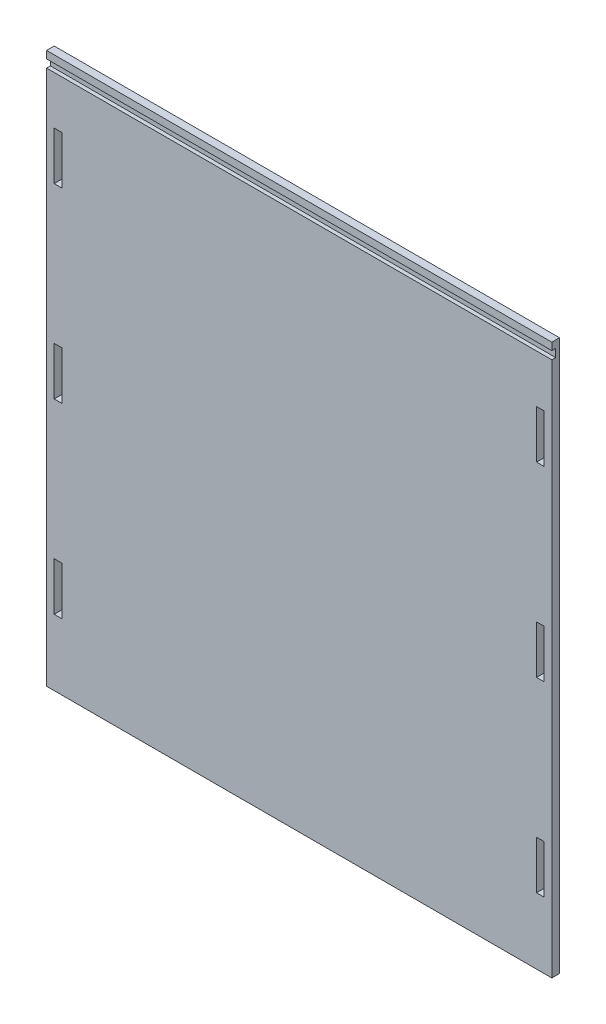
ISO-10303-21;
HEADER;
FILE_DESCRIPTION(('STEP AP214'),'2;1');
FILE_NAME('part.step','',(''),(''),'','','');
FILE_SCHEMA(('AUTOMOTIVE_DESIGN { 1 0 10303 214 1 1 1 1 }'));
ENDSEC;
DATA;
#1=APPLICATION_CONTEXT('core data for automotive mechanical design processes');
#2=APPLICATION_PROTOCOL_DEFINITION('international standard','automotive_design',2000,#1);
#3=PRODUCT_CONTEXT('',#1,'mechanical');
#4=PRODUCT('Part','Part','',(#3));
#5=PRODUCT_RELATED_PRODUCT_CATEGORY('part','',(#4));
#6=PRODUCT_DEFINITION_FORMATION('','',#4);
#7=PRODUCT_DEFINITION_CONTEXT('part definition',#1,'design');
#8=PRODUCT_DEFINITION('design','',#6,#7);
#9=PRODUCT_DEFINITION_SHAPE('','',#8);
#10=(LENGTH_UNIT() NAMED_UNIT(*) SI_UNIT(.MILLI.,.METRE.));
#11=(NAMED_UNIT(*) PLANE_ANGLE_UNIT() SI_UNIT($,.RADIAN.));
#12=(NAMED_UNIT(*) SI_UNIT($,.STERADIAN.) SOLID_ANGLE_UNIT());
#13=UNCERTAINTY_MEASURE_WITH_UNIT(LENGTH_MEASURE(1.E-05),#10,'distance_accuracy_value','');
#14=(GEOMETRIC_REPRESENTATION_CONTEXT(3) GLOBAL_UNCERTAINTY_ASSIGNED_CONTEXT((#13)) GLOBAL_UNIT_ASSIGNED_CONTEXT((#10,
#11,#12)) REPRESENTATION_CONTEXT('',''));
#15=CARTESIAN_POINT('',(0.,0.,0.));
#16=DIRECTION('',(0.,0.,1.));
#17=DIRECTION('',(1.,0.,0.));
#18=AXIS2_PLACEMENT_3D('',#15,#16,#17);
#19=CARTESIAN_POINT('',(0.,0.,6.35));
#20=DIRECTION('',(0.,0.,-1.));
#21=DIRECTION('',(-1.,0.,0.));
#22=AXIS2_PLACEMENT_3D('',#19,#20,#21);
#23=PLANE('',#22);
#24=DIRECTION('',(0.,-1.,0.));
#25=VECTOR('',#24,1.);
#26=CARTESIAN_POINT('',(0.,0.,6.35));
#27=LINE('',#26,#25);
#28=CARTESIAN_POINT('',(0.,457.7,6.35));
#29=VERTEX_POINT('',#28);
#30=CARTESIAN_POINT('',(0.,451.604,6.35));
#31=VERTEX_POINT('',#30);
#32=EDGE_CURVE('E273',#29,#31,#27,.T.);
#33=ORIENTED_EDGE('',*,*,#32,.T.);
#34=DIRECTION('',(1.,0.,0.));
#35=VECTOR('',#34,1.);
#36=CARTESIAN_POINT('',(0.,451.604,6.35));
#37=LINE('',#36,#35);
#38=CARTESIAN_POINT('',(420.,451.604,6.35));
#39=VERTEX_POINT('',#38);
#40=EDGE_CURVE('E332',#31,#39,#37,.T.);
#41=ORIENTED_EDGE('',*,*,#40,.T.);
#42=DIRECTION('',(0.,1.,0.));
#43=VECTOR('',#42,1.);
#44=CARTESIAN_POINT('',(420.,0.,6.35));
#45=LINE('',#44,#43);
#46=CARTESIAN_POINT('',(420.,457.7,6.35));
#47=VERTEX_POINT('',#46);
#48=EDGE_CURVE('E288',#39,#47,#45,.T.);
#49=ORIENTED_EDGE('',*,*,#48,.T.);
#50=DIRECTION('',(-1.,0.,0.));
#51=VECTOR('',#50,1.);
#52=CARTESIAN_POINT('',(413.65,457.7,6.35));
#53=LINE('',#52,#51);
#54=EDGE_CURVE('E291',#47,#29,#53,.T.);
#55=ORIENTED_EDGE('',*,*,#54,.T.);
#56=EDGE_LOOP('',(#33,#41,#49,#55));
#57=FACE_BOUND('',#56,.T.);
#58=ADVANCED_FACE('F39',(#57),#23,.F.);
#59=DIRECTION('',(-1.,0.,0.));
#60=VECTOR('',#59,1.);
#61=CARTESIAN_POINT('',(407.3,95.,6.35));
#62=LINE('',#61,#60);
#63=CARTESIAN_POINT('',(413.65,95.,6.35));
#64=VERTEX_POINT('',#63);
#65=CARTESIAN_POINT('',(407.3,95.,6.35));
#66=VERTEX_POINT('',#65);
#67=EDGE_CURVE('E395',#64,#66,#62,.T.);
#68=ORIENTED_EDGE('',*,*,#67,.F.);
#69=DIRECTION('',(0.,1.,0.));
#70=VECTOR('',#69,1.);
#71=CARTESIAN_POINT('',(413.65,95.,6.35));
#72=LINE('',#71,#70);
#73=CARTESIAN_POINT('',(413.65,55.,6.35));
#74=VERTEX_POINT('',#73);
#75=EDGE_CURVE('E406',#74,#64,#72,.T.);
#76=ORIENTED_EDGE('',*,*,#75,.F.);
#77=DIRECTION('',(1.,0.,0.));
#78=VECTOR('',#77,1.);
#79=CARTESIAN_POINT('',(413.65,55.,6.35));
#80=LINE('',#79,#78);
#81=CARTESIAN_POINT('',(407.3,55.,6.35));
#82=VERTEX_POINT('',#81);
#83=EDGE_CURVE('E402',#82,#74,#80,.T.);
#84=ORIENTED_EDGE('',*,*,#83,.F.);
#85=DIRECTION('',(0.,-1.,0.));
#86=VECTOR('',#85,1.);
#87=CARTESIAN_POINT('',(407.3,55.,6.35));
#88=LINE('',#87,#86);
#89=EDGE_CURVE('E398',#66,#82,#88,.T.);
#90=ORIENTED_EDGE('',*,*,#89,.F.);
#91=EDGE_LOOP('',(#68,#76,#84,#90));
#92=FACE_BOUND('',#91,.T.);
#93=DIRECTION('',(-1.,0.,0.));
#94=VECTOR('',#93,1.);
#95=CARTESIAN_POINT('',(6.34999999999998,250.,6.35));
#96=LINE('',#95,#94);
#97=CARTESIAN_POINT('',(12.7,250.,6.35));
#98=VERTEX_POINT('',#97);
#99=CARTESIAN_POINT('',(6.34999999999998,250.,6.35));
#100=VERTEX_POINT('',#99);
#101=EDGE_CURVE('E481',#98,#100,#96,.T.);
#102=ORIENTED_EDGE('',*,*,#101,.F.);
#103=DIRECTION('',(0.,1.,0.));
#104=VECTOR('',#103,1.);
#105=CARTESIAN_POINT('',(12.7,250.,6.35));
#106=LINE('',#105,#104);
#107=CARTESIAN_POINT('',(12.7,210.,6.35));
#108=VERTEX_POINT('',#107);
#109=EDGE_CURVE('E492',#108,#98,#106,.T.);
#110=ORIENTED_EDGE('',*,*,#109,.F.);
#111=DIRECTION('',(1.,0.,0.));
#112=VECTOR('',#111,1.);
#113=CARTESIAN_POINT('',(12.7,210.,6.35));
#114=LINE('',#113,#112);
#115=CARTESIAN_POINT('',(6.34999999999998,210.,6.35));
#116=VERTEX_POINT('',#115);
#117=EDGE_CURVE('E488',#116,#108,#114,.T.);
#118=ORIENTED_EDGE('',*,*,#117,.F.);
#119=DIRECTION('',(0.,-1.,0.));
#120=VECTOR('',#119,1.);
#121=CARTESIAN_POINT('',(6.34999999999998,210.,6.35));
#122=LINE('',#121,#120);
#123=EDGE_CURVE('E484',#100,#116,#122,.T.);
#124=ORIENTED_EDGE('',*,*,#123,.F.);
#125=EDGE_LOOP('',(#102,#110,#118,#124));
#126=FACE_BOUND('',#125,.T.);
#127=DIRECTION('',(0.,-1.,0.));
#128=VECTOR('',#127,1.);
#129=CARTESIAN_POINT('',(407.3,365.,6.35));
#130=LINE('',#129,#128);
#131=CARTESIAN_POINT('',(407.3,405.,6.35));
#132=VERTEX_POINT('',#131);
#133=CARTESIAN_POINT('',(407.3,365.,6.35));
#134=VERTEX_POINT('',#133);
#135=EDGE_CURVE('E567',#132,#134,#130,.T.);
#136=ORIENTED_EDGE('',*,*,#135,.F.);
#137=DIRECTION('',(-1.,0.,0.));
#138=VECTOR('',#137,1.);
#139=CARTESIAN_POINT('',(407.3,405.,6.35));
#140=LINE('',#139,#138);
#141=CARTESIAN_POINT('',(413.65,405.,6.35));
#142=VERTEX_POINT('',#141);
#143=EDGE_CURVE('E578',#142,#132,#140,.T.);
#144=ORIENTED_EDGE('',*,*,#143,.F.);
#145=DIRECTION('',(0.,1.,0.));
#146=VECTOR('',#145,1.);
#147=CARTESIAN_POINT('',(413.65,405.,6.35));
#148=LINE('',#147,#146);
#149=CARTESIAN_POINT('',(413.65,365.,6.35));
#150=VERTEX_POINT('',#149);
#151=EDGE_CURVE('E574',#150,#142,#148,.T.);
#152=ORIENTED_EDGE('',*,*,#151,.F.);
#153=DIRECTION('',(1.,0.,0.));
#154=VECTOR('',#153,1.);
#155=CARTESIAN_POINT('',(413.65,365.,6.35));
#156=LINE('',#155,#154);
#157=EDGE_CURVE('E570',#134,#150,#156,.T.);
#158=ORIENTED_EDGE('',*,*,#157,.F.);
#159=EDGE_LOOP('',(#136,#144,#152,#158));
#160=FACE_BOUND('',#159,.T.);
#161=CARTESIAN_POINT('',(420.,0.,6.35));
#162=VERTEX_POINT('',#161);
#163=CARTESIAN_POINT('',(420.,445.,6.35));
#164=VERTEX_POINT('',#163);
#165=EDGE_CURVE('E266',#162,#164,#45,.T.);
#166=ORIENTED_EDGE('',*,*,#165,.T.);
#167=DIRECTION('',(1.,0.,0.));
#168=VECTOR('',#167,1.);
#169=CARTESIAN_POINT('',(0.,445.,6.35));
#170=LINE('',#169,#168);
#171=CARTESIAN_POINT('',(0.,445.,6.35));
#172=VERTEX_POINT('',#171);
#173=EDGE_CURVE('E55',#172,#164,#170,.T.);
#174=ORIENTED_EDGE('',*,*,#173,.F.);
#175=CARTESIAN_POINT('',(0.,0.,6.35));
#176=VERTEX_POINT('',#175);
#177=EDGE_CURVE('E263',#172,#176,#27,.T.);
#178=ORIENTED_EDGE('',*,*,#177,.T.);
#179=DIRECTION('',(1.,0.,0.));
#180=VECTOR('',#179,1.);
#181=CARTESIAN_POINT('',(0.,0.,6.35));
#182=LINE('',#181,#180);
#183=EDGE_CURVE('E279',#176,#162,#182,.T.);
#184=ORIENTED_EDGE('',*,*,#183,.T.);
#185=EDGE_LOOP('',(#166,#174,#178,#184));
#186=FACE_BOUND('',#185,.T.);
#187=DIRECTION('',(-1.,0.,0.));
#188=VECTOR('',#187,1.);
#189=CARTESIAN_POINT('',(6.35,405.,6.35));
#190=LINE('',#189,#188);
#191=CARTESIAN_POINT('',(12.7,405.,6.35));
#192=VERTEX_POINT('',#191);
#193=CARTESIAN_POINT('',(6.35,405.,6.35));
#194=VERTEX_POINT('',#193);
#195=EDGE_CURVE('E524',#192,#194,#190,.T.);
#196=ORIENTED_EDGE('',*,*,#195,.F.);
#197=DIRECTION('',(0.,1.,0.));
#198=VECTOR('',#197,1.);
#199=CARTESIAN_POINT('',(12.7,365.,6.35));
#200=LINE('',#199,#198);
#201=CARTESIAN_POINT('',(12.7,365.,6.35));
#202=VERTEX_POINT('',#201);
#203=EDGE_CURVE('E535',#202,#192,#200,.T.);
#204=ORIENTED_EDGE('',*,*,#203,.F.);
#205=DIRECTION('',(1.,0.,0.));
#206=VECTOR('',#205,1.);
#207=CARTESIAN_POINT('',(6.35,365.,6.35));
#208=LINE('',#207,#206);
#209=CARTESIAN_POINT('',(6.35,365.,6.35));
#210=VERTEX_POINT('',#209);
#211=EDGE_CURVE('E531',#210,#202,#208,.T.);
#212=ORIENTED_EDGE('',*,*,#211,.F.);
#213=DIRECTION('',(0.,-1.,0.));
#214=VECTOR('',#213,1.);
#215=CARTESIAN_POINT('',(6.35,405.,6.35));
#216=LINE('',#215,#214);
#217=EDGE_CURVE('E527',#194,#210,#216,.T.);
#218=ORIENTED_EDGE('',*,*,#217,.F.);
#219=EDGE_LOOP('',(#196,#204,#212,#218));
#220=FACE_BOUND('',#219,.T.);
#221=DIRECTION('',(-1.,0.,0.));
#222=VECTOR('',#221,1.);
#223=CARTESIAN_POINT('',(407.3,250.,6.35));
#224=LINE('',#223,#222);
#225=CARTESIAN_POINT('',(413.65,250.,6.35));
#226=VERTEX_POINT('',#225);
#227=CARTESIAN_POINT('',(407.3,250.,6.35));
#228=VERTEX_POINT('',#227);
#229=EDGE_CURVE('E438',#226,#228,#224,.T.);
#230=ORIENTED_EDGE('',*,*,#229,.F.);
#231=DIRECTION('',(0.,1.,0.));
#232=VECTOR('',#231,1.);
#233=CARTESIAN_POINT('',(413.65,250.,6.35));
#234=LINE('',#233,#232);
#235=CARTESIAN_POINT('',(413.65,210.,6.35));
#236=VERTEX_POINT('',#235);
#237=EDGE_CURVE('E449',#236,#226,#234,.T.);
#238=ORIENTED_EDGE('',*,*,#237,.F.);
#239=DIRECTION('',(1.,0.,0.));
#240=VECTOR('',#239,1.);
#241=CARTESIAN_POINT('',(413.65,210.,6.35));
#242=LINE('',#241,#240);
#243=CARTESIAN_POINT('',(407.3,210.,6.35));
#244=VERTEX_POINT('',#243);
#245=EDGE_CURVE('E445',#244,#236,#242,.T.);
#246=ORIENTED_EDGE('',*,*,#245,.F.);
#247=DIRECTION('',(0.,-1.,0.));
#248=VECTOR('',#247,1.);
#249=CARTESIAN_POINT('',(407.3,210.,6.35));
#250=LINE('',#249,#248);
#251=EDGE_CURVE('E441',#228,#244,#250,.T.);
#252=ORIENTED_EDGE('',*,*,#251,.F.);
#253=EDGE_LOOP('',(#230,#238,#246,#252));
#254=FACE_BOUND('',#253,.T.);
#255=DIRECTION('',(-1.,0.,0.));
#256=VECTOR('',#255,1.);
#257=CARTESIAN_POINT('',(6.35000000000003,95.,6.35));
#258=LINE('',#257,#256);
#259=CARTESIAN_POINT('',(12.7,95.,6.35));
#260=VERTEX_POINT('',#259);
#261=CARTESIAN_POINT('',(6.35000000000003,95.,6.35));
#262=VERTEX_POINT('',#261);
#263=EDGE_CURVE('E354',#260,#262,#258,.T.);
#264=ORIENTED_EDGE('',*,*,#263,.F.);
#265=DIRECTION('',(0.,1.,0.));
#266=VECTOR('',#265,1.);
#267=CARTESIAN_POINT('',(12.7,95.,6.35));
#268=LINE('',#267,#266);
#269=CARTESIAN_POINT('',(12.7,55.,6.35));
#270=VERTEX_POINT('',#269);
#271=EDGE_CURVE('E364',#270,#260,#268,.T.);
#272=ORIENTED_EDGE('',*,*,#271,.F.);
#273=DIRECTION('',(1.,0.,0.));
#274=VECTOR('',#273,1.);
#275=CARTESIAN_POINT('',(12.7,55.,6.35));
#276=LINE('',#275,#274);
#277=CARTESIAN_POINT('',(6.35000000000003,55.,6.35));
#278=VERTEX_POINT('',#277);
#279=EDGE_CURVE('E361',#278,#270,#276,.T.);
#280=ORIENTED_EDGE('',*,*,#279,.F.);
#281=DIRECTION('',(0.,-1.,0.));
#282=VECTOR('',#281,1.);
#283=CARTESIAN_POINT('',(6.35000000000003,55.,6.35));
#284=LINE('',#283,#282);
#285=EDGE_CURVE('E357',#262,#278,#284,.T.);
#286=ORIENTED_EDGE('',*,*,#285,.F.);
#287=EDGE_LOOP('',(#264,#272,#280,#286));
#288=FACE_BOUND('',#287,.T.);
#289=ADVANCED_FACE('F261',(#92,#126,#160,#186,#220,#254,#288),#23,.F.);
#290=CARTESIAN_POINT('',(0.,0.,0.));
#291=DIRECTION('',(0.,0.,-1.));
#292=DIRECTION('',(-1.,0.,0.));
#293=AXIS2_PLACEMENT_3D('',#290,#291,#292);
#294=PLANE('',#293);
#295=DIRECTION('',(0.,-1.,0.));
#296=VECTOR('',#295,1.);
#297=CARTESIAN_POINT('',(0.,0.,0.));
#298=LINE('',#297,#296);
#299=CARTESIAN_POINT('',(0.,457.7,0.));
#300=VERTEX_POINT('',#299);
#301=CARTESIAN_POINT('',(0.,0.,0.));
#302=VERTEX_POINT('',#301);
#303=EDGE_CURVE('E295',#300,#302,#298,.T.);
#304=ORIENTED_EDGE('',*,*,#303,.F.);
#305=DIRECTION('',(-1.,0.,0.));
#306=VECTOR('',#305,1.);
#307=CARTESIAN_POINT('',(0.,457.7,0.));
#308=LINE('',#307,#306);
#309=CARTESIAN_POINT('',(420.,457.7,0.));
#310=VERTEX_POINT('',#309);
#311=EDGE_CURVE('E274',#310,#300,#308,.T.);
#312=ORIENTED_EDGE('',*,*,#311,.F.);
#313=DIRECTION('',(0.,1.,0.));
#314=VECTOR('',#313,1.);
#315=CARTESIAN_POINT('',(420.,0.,0.));
#316=LINE('',#315,#314);
#317=CARTESIAN_POINT('',(420.,0.,0.));
#318=VERTEX_POINT('',#317);
#319=EDGE_CURVE('E280',#318,#310,#316,.T.);
#320=ORIENTED_EDGE('',*,*,#319,.F.);
#321=DIRECTION('',(1.,0.,0.));
#322=VECTOR('',#321,1.);
#323=CARTESIAN_POINT('',(0.,0.,0.));
#324=LINE('',#323,#322);
#325=EDGE_CURVE('E298',#302,#318,#324,.T.);
#326=ORIENTED_EDGE('',*,*,#325,.F.);
#327=EDGE_LOOP('',(#304,#312,#320,#326));
#328=FACE_BOUND('',#327,.T.);
#329=DIRECTION('',(-1.,0.,0.));
#330=VECTOR('',#329,1.);
#331=CARTESIAN_POINT('',(407.3,405.,0.));
#332=LINE('',#331,#330);
#333=CARTESIAN_POINT('',(413.65,405.,0.));
#334=VERTEX_POINT('',#333);
#335=CARTESIAN_POINT('',(407.3,405.,0.));
#336=VERTEX_POINT('',#335);
#337=EDGE_CURVE('E571',#334,#336,#332,.T.);
#338=ORIENTED_EDGE('',*,*,#337,.T.);
#339=DIRECTION('',(0.,-1.,0.));
#340=VECTOR('',#339,1.);
#341=CARTESIAN_POINT('',(407.3,365.,0.));
#342=LINE('',#341,#340);
#343=CARTESIAN_POINT('',(407.3,365.,0.));
#344=VERTEX_POINT('',#343);
#345=EDGE_CURVE('E566',#336,#344,#342,.T.);
#346=ORIENTED_EDGE('',*,*,#345,.T.);
#347=DIRECTION('',(1.,0.,0.));
#348=VECTOR('',#347,1.);
#349=CARTESIAN_POINT('',(413.65,365.,0.));
#350=LINE('',#349,#348);
#351=CARTESIAN_POINT('',(413.65,365.,0.));
#352=VERTEX_POINT('',#351);
#353=EDGE_CURVE('E585',#344,#352,#350,.T.);
#354=ORIENTED_EDGE('',*,*,#353,.T.);
#355=DIRECTION('',(0.,1.,0.));
#356=VECTOR('',#355,1.);
#357=CARTESIAN_POINT('',(413.65,405.,0.));
#358=LINE('',#357,#356);
#359=EDGE_CURVE('E589',#352,#334,#358,.T.);
#360=ORIENTED_EDGE('',*,*,#359,.T.);
#361=EDGE_LOOP('',(#338,#346,#354,#360));
#362=FACE_BOUND('',#361,.T.);
#363=DIRECTION('',(0.,1.,0.));
#364=VECTOR('',#363,1.);
#365=CARTESIAN_POINT('',(12.7,365.,0.));
#366=LINE('',#365,#364);
#367=CARTESIAN_POINT('',(12.7,365.,0.));
#368=VERTEX_POINT('',#367);
#369=CARTESIAN_POINT('',(12.7,405.,0.));
#370=VERTEX_POINT('',#369);
#371=EDGE_CURVE('E528',#368,#370,#366,.T.);
#372=ORIENTED_EDGE('',*,*,#371,.T.);
#373=DIRECTION('',(-1.,0.,0.));
#374=VECTOR('',#373,1.);
#375=CARTESIAN_POINT('',(6.35,405.,0.));
#376=LINE('',#375,#374);
#377=CARTESIAN_POINT('',(6.35,405.,0.));
#378=VERTEX_POINT('',#377);
#379=EDGE_CURVE('E523',#370,#378,#376,.T.);
#380=ORIENTED_EDGE('',*,*,#379,.T.);
#381=DIRECTION('',(0.,-1.,0.));
#382=VECTOR('',#381,1.);
#383=CARTESIAN_POINT('',(6.35,405.,0.));
#384=LINE('',#383,#382);
#385=CARTESIAN_POINT('',(6.35,365.,0.));
#386=VERTEX_POINT('',#385);
#387=EDGE_CURVE('E542',#378,#386,#384,.T.);
#388=ORIENTED_EDGE('',*,*,#387,.T.);
#389=DIRECTION('',(1.,0.,0.));
#390=VECTOR('',#389,1.);
#391=CARTESIAN_POINT('',(6.35,365.,0.));
#392=LINE('',#391,#390);
#393=EDGE_CURVE('E546',#386,#368,#392,.T.);
#394=ORIENTED_EDGE('',*,*,#393,.T.);
#395=EDGE_LOOP('',(#372,#380,#388,#394));
#396=FACE_BOUND('',#395,.T.);
#397=DIRECTION('',(0.,1.,0.));
#398=VECTOR('',#397,1.);
#399=CARTESIAN_POINT('',(12.7,250.,0.));
#400=LINE('',#399,#398);
#401=CARTESIAN_POINT('',(12.7,210.,0.));
#402=VERTEX_POINT('',#401);
#403=CARTESIAN_POINT('',(12.7,250.,0.));
#404=VERTEX_POINT('',#403);
#405=EDGE_CURVE('E485',#402,#404,#400,.T.);
#406=ORIENTED_EDGE('',*,*,#405,.T.);
#407=DIRECTION('',(-1.,0.,0.));
#408=VECTOR('',#407,1.);
#409=CARTESIAN_POINT('',(6.34999999999998,250.,0.));
#410=LINE('',#409,#408);
#411=CARTESIAN_POINT('',(6.34999999999998,250.,0.));
#412=VERTEX_POINT('',#411);
#413=EDGE_CURVE('E480',#404,#412,#410,.T.);
#414=ORIENTED_EDGE('',*,*,#413,.T.);
#415=DIRECTION('',(0.,-1.,0.));
#416=VECTOR('',#415,1.);
#417=CARTESIAN_POINT('',(6.34999999999998,210.,0.));
#418=LINE('',#417,#416);
#419=CARTESIAN_POINT('',(6.34999999999998,210.,0.));
#420=VERTEX_POINT('',#419);
#421=EDGE_CURVE('E499',#412,#420,#418,.T.);
#422=ORIENTED_EDGE('',*,*,#421,.T.);
#423=DIRECTION('',(1.,0.,0.));
#424=VECTOR('',#423,1.);
#425=CARTESIAN_POINT('',(12.7,210.,0.));
#426=LINE('',#425,#424);
#427=EDGE_CURVE('E503',#420,#402,#426,.T.);
#428=ORIENTED_EDGE('',*,*,#427,.T.);
#429=EDGE_LOOP('',(#406,#414,#422,#428));
#430=FACE_BOUND('',#429,.T.);
#431=DIRECTION('',(0.,1.,0.));
#432=VECTOR('',#431,1.);
#433=CARTESIAN_POINT('',(413.65,250.,0.));
#434=LINE('',#433,#432);
#435=CARTESIAN_POINT('',(413.65,210.,0.));
#436=VERTEX_POINT('',#435);
#437=CARTESIAN_POINT('',(413.65,250.,0.));
#438=VERTEX_POINT('',#437);
#439=EDGE_CURVE('E442',#436,#438,#434,.T.);
#440=ORIENTED_EDGE('',*,*,#439,.T.);
#441=DIRECTION('',(-1.,0.,0.));
#442=VECTOR('',#441,1.);
#443=CARTESIAN_POINT('',(407.3,250.,0.));
#444=LINE('',#443,#442);
#445=CARTESIAN_POINT('',(407.3,250.,0.));
#446=VERTEX_POINT('',#445);
#447=EDGE_CURVE('E437',#438,#446,#444,.T.);
#448=ORIENTED_EDGE('',*,*,#447,.T.);
#449=DIRECTION('',(0.,-1.,0.));
#450=VECTOR('',#449,1.);
#451=CARTESIAN_POINT('',(407.3,210.,0.));
#452=LINE('',#451,#450);
#453=CARTESIAN_POINT('',(407.3,210.,0.));
#454=VERTEX_POINT('',#453);
#455=EDGE_CURVE('E456',#446,#454,#452,.T.);
#456=ORIENTED_EDGE('',*,*,#455,.T.);
#457=DIRECTION('',(1.,0.,0.));
#458=VECTOR('',#457,1.);
#459=CARTESIAN_POINT('',(413.65,210.,0.));
#460=LINE('',#459,#458);
#461=EDGE_CURVE('E460',#454,#436,#460,.T.);
#462=ORIENTED_EDGE('',*,*,#461,.T.);
#463=EDGE_LOOP('',(#440,#448,#456,#462));
#464=FACE_BOUND('',#463,.T.);
#465=DIRECTION('',(0.,1.,0.));
#466=VECTOR('',#465,1.);
#467=CARTESIAN_POINT('',(413.65,95.,0.));
#468=LINE('',#467,#466);
#469=CARTESIAN_POINT('',(413.65,55.,0.));
#470=VERTEX_POINT('',#469);
#471=CARTESIAN_POINT('',(413.65,95.,0.));
#472=VERTEX_POINT('',#471);
#473=EDGE_CURVE('E399',#470,#472,#468,.T.);
#474=ORIENTED_EDGE('',*,*,#473,.T.);
#475=DIRECTION('',(-1.,0.,0.));
#476=VECTOR('',#475,1.);
#477=CARTESIAN_POINT('',(407.3,95.,0.));
#478=LINE('',#477,#476);
#479=CARTESIAN_POINT('',(407.3,95.,0.));
#480=VERTEX_POINT('',#479);
#481=EDGE_CURVE('E394',#472,#480,#478,.T.);
#482=ORIENTED_EDGE('',*,*,#481,.T.);
#483=DIRECTION('',(0.,-1.,0.));
#484=VECTOR('',#483,1.);
#485=CARTESIAN_POINT('',(407.3,55.,0.));
#486=LINE('',#485,#484);
#487=CARTESIAN_POINT('',(407.3,55.,0.));
#488=VERTEX_POINT('',#487);
#489=EDGE_CURVE('E413',#480,#488,#486,.T.);
#490=ORIENTED_EDGE('',*,*,#489,.T.);
#491=DIRECTION('',(1.,0.,0.));
#492=VECTOR('',#491,1.);
#493=CARTESIAN_POINT('',(413.65,55.,0.));
#494=LINE('',#493,#492);
#495=EDGE_CURVE('E417',#488,#470,#494,.T.);
#496=ORIENTED_EDGE('',*,*,#495,.T.);
#497=EDGE_LOOP('',(#474,#482,#490,#496));
#498=FACE_BOUND('',#497,.T.);
#499=DIRECTION('',(0.,1.,0.));
#500=VECTOR('',#499,1.);
#501=CARTESIAN_POINT('',(12.7,95.,0.));
#502=LINE('',#501,#500);
#503=CARTESIAN_POINT('',(12.7,55.,0.));
#504=VERTEX_POINT('',#503);
#505=CARTESIAN_POINT('',(12.7,95.,0.));
#506=VERTEX_POINT('',#505);
#507=EDGE_CURVE('E358',#504,#506,#502,.T.);
#508=ORIENTED_EDGE('',*,*,#507,.T.);
#509=DIRECTION('',(-1.,0.,0.));
#510=VECTOR('',#509,1.);
#511=CARTESIAN_POINT('',(6.35000000000003,95.,0.));
#512=LINE('',#511,#510);
#513=CARTESIAN_POINT('',(6.35000000000003,95.,0.));
#514=VERTEX_POINT('',#513);
#515=EDGE_CURVE('E348',#506,#514,#512,.T.);
#516=ORIENTED_EDGE('',*,*,#515,.T.);
#517=DIRECTION('',(0.,-1.,0.));
#518=VECTOR('',#517,1.);
#519=CARTESIAN_POINT('',(6.35000000000003,55.,0.));
#520=LINE('',#519,#518);
#521=CARTESIAN_POINT('',(6.35000000000003,55.,0.));
#522=VERTEX_POINT('',#521);
#523=EDGE_CURVE('E371',#514,#522,#520,.T.);
#524=ORIENTED_EDGE('',*,*,#523,.T.);
#525=DIRECTION('',(1.,0.,0.));
#526=VECTOR('',#525,1.);
#527=CARTESIAN_POINT('',(12.7,55.,0.));
#528=LINE('',#527,#526);
#529=EDGE_CURVE('E375',#522,#504,#528,.T.);
#530=ORIENTED_EDGE('',*,*,#529,.T.);
#531=EDGE_LOOP('',(#508,#516,#524,#530));
#532=FACE_BOUND('',#531,.T.);
#533=ADVANCED_FACE('F321',(#328,#362,#396,#430,#464,#498,#532),#294,.T.);
#534=CARTESIAN_POINT('',(0.,0.,6.35));
#535=DIRECTION('',(1.,0.,0.));
#536=DIRECTION('',(0.,0.,-1.));
#537=AXIS2_PLACEMENT_3D('',#534,#535,#536);
#538=PLANE('',#537);
#539=DIRECTION('',(0.,1.,0.));
#540=VECTOR('',#539,1.);
#541=CARTESIAN_POINT('',(0.,451.604,3.175));
#542=LINE('',#541,#540);
#543=CARTESIAN_POINT('',(0.,445.,3.175));
#544=VERTEX_POINT('',#543);
#545=CARTESIAN_POINT('',(0.,451.604,3.175));
#546=VERTEX_POINT('',#545);
#547=EDGE_CURVE('E256',#544,#546,#542,.T.);
#548=ORIENTED_EDGE('',*,*,#547,.T.);
#549=DIRECTION('',(0.,0.,1.));
#550=VECTOR('',#549,1.);
#551=CARTESIAN_POINT('',(0.,451.604,6.35));
#552=LINE('',#551,#550);
#553=EDGE_CURVE('E268',#546,#31,#552,.T.);
#554=ORIENTED_EDGE('',*,*,#553,.T.);
#555=ORIENTED_EDGE('',*,*,#32,.F.);
#556=DIRECTION('',(0.,0.,-1.));
#557=VECTOR('',#556,1.);
#558=CARTESIAN_POINT('',(0.,457.7,6.35));
#559=LINE('',#558,#557);
#560=EDGE_CURVE('E294',#29,#300,#559,.T.);
#561=ORIENTED_EDGE('',*,*,#560,.T.);
#562=ORIENTED_EDGE('',*,*,#303,.T.);
#563=DIRECTION('',(0.,0.,-1.));
#564=VECTOR('',#563,1.);
#565=CARTESIAN_POINT('',(0.,0.,6.35));
#566=LINE('',#565,#564);
#567=EDGE_CURVE('E11',#176,#302,#566,.T.);
#568=ORIENTED_EDGE('',*,*,#567,.F.);
#569=ORIENTED_EDGE('',*,*,#177,.F.);
#570=DIRECTION('',(0.,0.,-1.));
#571=VECTOR('',#570,1.);
#572=CARTESIAN_POINT('',(0.,445.,6.35));
#573=LINE('',#572,#571);
#574=EDGE_CURVE('E248',#172,#544,#573,.T.);
#575=ORIENTED_EDGE('',*,*,#574,.T.);
#576=EDGE_LOOP('',(#548,#554,#555,#561,#562,#568,#569,#575));
#577=FACE_BOUND('',#576,.T.);
#578=ADVANCED_FACE('F41',(#577),#538,.F.);
#579=CARTESIAN_POINT('',(0.,0.,6.35));
#580=DIRECTION('',(0.,1.,0.));
#581=DIRECTION('',(0.,0.,1.));
#582=AXIS2_PLACEMENT_3D('',#579,#580,#581);
#583=PLANE('',#582);
#584=ORIENTED_EDGE('',*,*,#325,.T.);
#585=DIRECTION('',(0.,0.,-1.));
#586=VECTOR('',#585,1.);
#587=CARTESIAN_POINT('',(420.,0.,6.35));
#588=LINE('',#587,#586);
#589=EDGE_CURVE('E48',#162,#318,#588,.T.);
#590=ORIENTED_EDGE('',*,*,#589,.F.);
#591=ORIENTED_EDGE('',*,*,#183,.F.);
#592=ORIENTED_EDGE('',*,*,#567,.T.);
#593=EDGE_LOOP('',(#584,#590,#591,#592));
#594=FACE_BOUND('',#593,.T.);
#595=ADVANCED_FACE('F646',(#594),#583,.F.);
#596=CARTESIAN_POINT('',(420.,0.,6.35));
#597=DIRECTION('',(-1.,0.,0.));
#598=DIRECTION('',(0.,-1.,0.));
#599=AXIS2_PLACEMENT_3D('',#596,#597,#598);
#600=PLANE('',#599);
#601=ORIENTED_EDGE('',*,*,#48,.F.);
#602=DIRECTION('',(0.,0.,1.));
#603=VECTOR('',#602,1.);
#604=CARTESIAN_POINT('',(420.,451.604,6.35));
#605=LINE('',#604,#603);
#606=CARTESIAN_POINT('',(420.,451.604,3.175));
#607=VERTEX_POINT('',#606);
#608=EDGE_CURVE('E257',#607,#39,#605,.T.);
#609=ORIENTED_EDGE('',*,*,#608,.F.);
#610=DIRECTION('',(0.,1.,0.));
#611=VECTOR('',#610,1.);
#612=CARTESIAN_POINT('',(420.,451.604,3.175));
#613=LINE('',#612,#611);
#614=CARTESIAN_POINT('',(420.,445.,3.175));
#615=VERTEX_POINT('',#614);
#616=EDGE_CURVE('E337',#615,#607,#613,.T.);
#617=ORIENTED_EDGE('',*,*,#616,.F.);
#618=DIRECTION('',(0.,0.,-1.));
#619=VECTOR('',#618,1.);
#620=CARTESIAN_POINT('',(420.,445.,6.35));
#621=LINE('',#620,#619);
#622=EDGE_CURVE('E342',#164,#615,#621,.T.);
#623=ORIENTED_EDGE('',*,*,#622,.F.);
#624=ORIENTED_EDGE('',*,*,#165,.F.);
#625=ORIENTED_EDGE('',*,*,#589,.T.);
#626=ORIENTED_EDGE('',*,*,#319,.T.);
#627=DIRECTION('',(0.,0.,-1.));
#628=VECTOR('',#627,1.);
#629=CARTESIAN_POINT('',(420.,457.7,6.35));
#630=LINE('',#629,#628);
#631=EDGE_CURVE('E307',#47,#310,#630,.T.);
#632=ORIENTED_EDGE('',*,*,#631,.F.);
#633=EDGE_LOOP('',(#601,#609,#617,#623,#624,#625,#626,#632));
#634=FACE_BOUND('',#633,.T.);
#635=ADVANCED_FACE('F316',(#634),#600,.F.);
#636=CARTESIAN_POINT('',(0.,457.7,6.35));
#637=DIRECTION('',(0.,-1.,0.));
#638=DIRECTION('',(0.,0.,-1.));
#639=AXIS2_PLACEMENT_3D('',#636,#637,#638);
#640=PLANE('',#639);
#641=ORIENTED_EDGE('',*,*,#311,.T.);
#642=ORIENTED_EDGE('',*,*,#560,.F.);
#643=ORIENTED_EDGE('',*,*,#54,.F.);
#644=ORIENTED_EDGE('',*,*,#631,.T.);
#645=EDGE_LOOP('',(#641,#642,#643,#644));
#646=FACE_BOUND('',#645,.T.);
#647=ADVANCED_FACE('F325',(#646),#640,.F.);
#648=CARTESIAN_POINT('',(407.3,365.,6.35));
#649=DIRECTION('',(1.,0.,0.));
#650=DIRECTION('',(0.,0.,-1.));
#651=AXIS2_PLACEMENT_3D('',#648,#649,#650);
#652=PLANE('',#651);
#653=ORIENTED_EDGE('',*,*,#345,.F.);
#654=DIRECTION('',(0.,0.,-1.));
#655=VECTOR('',#654,1.);
#656=CARTESIAN_POINT('',(407.3,405.,6.35));
#657=LINE('',#656,#655);
#658=EDGE_CURVE('E581',#132,#336,#657,.T.);
#659=ORIENTED_EDGE('',*,*,#658,.F.);
#660=ORIENTED_EDGE('',*,*,#135,.T.);
#661=DIRECTION('',(0.,0.,-1.));
#662=VECTOR('',#661,1.);
#663=CARTESIAN_POINT('',(407.3,365.,6.35));
#664=LINE('',#663,#662);
#665=EDGE_CURVE('E284',#134,#344,#664,.T.);
#666=ORIENTED_EDGE('',*,*,#665,.T.);
#667=EDGE_LOOP('',(#653,#659,#660,#666));
#668=FACE_BOUND('',#667,.T.);
#669=ADVANCED_FACE('F610',(#668),#652,.T.);
#670=CARTESIAN_POINT('',(413.65,365.,6.35));
#671=DIRECTION('',(0.,1.,0.));
#672=DIRECTION('',(0.,0.,1.));
#673=AXIS2_PLACEMENT_3D('',#670,#671,#672);
#674=PLANE('',#673);
#675=ORIENTED_EDGE('',*,*,#353,.F.);
#676=ORIENTED_EDGE('',*,*,#665,.F.);
#677=ORIENTED_EDGE('',*,*,#157,.T.);
#678=DIRECTION('',(0.,0.,-1.));
#679=VECTOR('',#678,1.);
#680=CARTESIAN_POINT('',(413.65,365.,6.35));
#681=LINE('',#680,#679);
#682=EDGE_CURVE('E601',#150,#352,#681,.T.);
#683=ORIENTED_EDGE('',*,*,#682,.T.);
#684=EDGE_LOOP('',(#675,#676,#677,#683));
#685=FACE_BOUND('',#684,.T.);
#686=ADVANCED_FACE('F621',(#685),#674,.T.);
#687=CARTESIAN_POINT('',(413.65,405.,6.35));
#688=DIRECTION('',(-1.,0.,0.));
#689=DIRECTION('',(0.,0.,1.));
#690=AXIS2_PLACEMENT_3D('',#687,#688,#689);
#691=PLANE('',#690);
#692=ORIENTED_EDGE('',*,*,#359,.F.);
#693=ORIENTED_EDGE('',*,*,#682,.F.);
#694=ORIENTED_EDGE('',*,*,#151,.T.);
#695=DIRECTION('',(0.,0.,-1.));
#696=VECTOR('',#695,1.);
#697=CARTESIAN_POINT('',(413.65,405.,6.35));
#698=LINE('',#697,#696);
#699=EDGE_CURVE('E599',#142,#334,#698,.T.);
#700=ORIENTED_EDGE('',*,*,#699,.T.);
#701=EDGE_LOOP('',(#692,#693,#694,#700));
#702=FACE_BOUND('',#701,.T.);
#703=ADVANCED_FACE('F623',(#702),#691,.T.);
#704=CARTESIAN_POINT('',(407.3,405.,6.35));
#705=DIRECTION('',(0.,-1.,0.));
#706=DIRECTION('',(0.,0.,-1.));
#707=AXIS2_PLACEMENT_3D('',#704,#705,#706);
#708=PLANE('',#707);
#709=ORIENTED_EDGE('',*,*,#337,.F.);
#710=ORIENTED_EDGE('',*,*,#699,.F.);
#711=ORIENTED_EDGE('',*,*,#143,.T.);
#712=ORIENTED_EDGE('',*,*,#658,.T.);
#713=EDGE_LOOP('',(#709,#710,#711,#712));
#714=FACE_BOUND('',#713,.T.);
#715=ADVANCED_FACE('F617',(#714),#708,.T.);
#716=CARTESIAN_POINT('',(6.35,405.,6.35));
#717=DIRECTION('',(0.,-1.,0.));
#718=DIRECTION('',(0.,0.,-1.));
#719=AXIS2_PLACEMENT_3D('',#716,#717,#718);
#720=PLANE('',#719);
#721=ORIENTED_EDGE('',*,*,#379,.F.);
#722=DIRECTION('',(0.,0.,-1.));
#723=VECTOR('',#722,1.);
#724=CARTESIAN_POINT('',(12.7,405.,6.35));
#725=LINE('',#724,#723);
#726=EDGE_CURVE('E538',#192,#370,#725,.T.);
#727=ORIENTED_EDGE('',*,*,#726,.F.);
#728=ORIENTED_EDGE('',*,*,#195,.T.);
#729=DIRECTION('',(0.,0.,-1.));
#730=VECTOR('',#729,1.);
#731=CARTESIAN_POINT('',(6.35,405.,6.35));
#732=LINE('',#731,#730);
#733=EDGE_CURVE('E562',#194,#378,#732,.T.);
#734=ORIENTED_EDGE('',*,*,#733,.T.);
#735=EDGE_LOOP('',(#721,#727,#728,#734));
#736=FACE_BOUND('',#735,.T.);
#737=ADVANCED_FACE('F630',(#736),#720,.T.);
#738=CARTESIAN_POINT('',(6.35,405.,6.35));
#739=DIRECTION('',(1.,0.,0.));
#740=DIRECTION('',(0.,1.,0.));
#741=AXIS2_PLACEMENT_3D('',#738,#739,#740);
#742=PLANE('',#741);
#743=ORIENTED_EDGE('',*,*,#387,.F.);
#744=ORIENTED_EDGE('',*,*,#733,.F.);
#745=ORIENTED_EDGE('',*,*,#217,.T.);
#746=DIRECTION('',(0.,0.,-1.));
#747=VECTOR('',#746,1.);
#748=CARTESIAN_POINT('',(6.35,365.,6.35));
#749=LINE('',#748,#747);
#750=EDGE_CURVE('E559',#210,#386,#749,.T.);
#751=ORIENTED_EDGE('',*,*,#750,.T.);
#752=EDGE_LOOP('',(#743,#744,#745,#751));
#753=FACE_BOUND('',#752,.T.);
#754=ADVANCED_FACE('F848',(#753),#742,.T.);
#755=CARTESIAN_POINT('',(6.35,365.,6.35));
#756=DIRECTION('',(0.,1.,0.));
#757=DIRECTION('',(0.,0.,1.));
#758=AXIS2_PLACEMENT_3D('',#755,#756,#757);
#759=PLANE('',#758);
#760=ORIENTED_EDGE('',*,*,#393,.F.);
#761=ORIENTED_EDGE('',*,*,#750,.F.);
#762=ORIENTED_EDGE('',*,*,#211,.T.);
#763=DIRECTION('',(0.,0.,-1.));
#764=VECTOR('',#763,1.);
#765=CARTESIAN_POINT('',(12.7,365.,6.35));
#766=LINE('',#765,#764);
#767=EDGE_CURVE('E556',#202,#368,#766,.T.);
#768=ORIENTED_EDGE('',*,*,#767,.T.);
#769=EDGE_LOOP('',(#760,#761,#762,#768));
#770=FACE_BOUND('',#769,.T.);
#771=ADVANCED_FACE('F838',(#770),#759,.T.);
#772=CARTESIAN_POINT('',(12.7,365.,6.35));
#773=DIRECTION('',(-1.,0.,0.));
#774=DIRECTION('',(0.,-1.,0.));
#775=AXIS2_PLACEMENT_3D('',#772,#773,#774);
#776=PLANE('',#775);
#777=ORIENTED_EDGE('',*,*,#371,.F.);
#778=ORIENTED_EDGE('',*,*,#767,.F.);
#779=ORIENTED_EDGE('',*,*,#203,.T.);
#780=ORIENTED_EDGE('',*,*,#726,.T.);
#781=EDGE_LOOP('',(#777,#778,#779,#780));
#782=FACE_BOUND('',#781,.T.);
#783=ADVANCED_FACE('F828',(#782),#776,.T.);
#784=CARTESIAN_POINT('',(6.34999999999998,250.,6.35));
#785=DIRECTION('',(0.,-1.,0.));
#786=DIRECTION('',(0.,0.,-1.));
#787=AXIS2_PLACEMENT_3D('',#784,#785,#786);
#788=PLANE('',#787);
#789=ORIENTED_EDGE('',*,*,#413,.F.);
#790=DIRECTION('',(0.,0.,-1.));
#791=VECTOR('',#790,1.);
#792=CARTESIAN_POINT('',(12.7,250.,6.35));
#793=LINE('',#792,#791);
#794=EDGE_CURVE('E495',#98,#404,#793,.T.);
#795=ORIENTED_EDGE('',*,*,#794,.F.);
#796=ORIENTED_EDGE('',*,*,#101,.T.);
#797=DIRECTION('',(0.,0.,-1.));
#798=VECTOR('',#797,1.);
#799=CARTESIAN_POINT('',(6.34999999999998,250.,6.35));
#800=LINE('',#799,#798);
#801=EDGE_CURVE('E519',#100,#412,#800,.T.);
#802=ORIENTED_EDGE('',*,*,#801,.T.);
#803=EDGE_LOOP('',(#789,#795,#796,#802));
#804=FACE_BOUND('',#803,.T.);
#805=ADVANCED_FACE('F818',(#804),#788,.T.);
#806=CARTESIAN_POINT('',(6.34999999999998,210.,6.35));
#807=DIRECTION('',(1.,0.,0.));
#808=DIRECTION('',(0.,0.,-1.));
#809=AXIS2_PLACEMENT_3D('',#806,#807,#808);
#810=PLANE('',#809);
#811=ORIENTED_EDGE('',*,*,#421,.F.);
#812=ORIENTED_EDGE('',*,*,#801,.F.);
#813=ORIENTED_EDGE('',*,*,#123,.T.);
#814=DIRECTION('',(0.,0.,-1.));
#815=VECTOR('',#814,1.);
#816=CARTESIAN_POINT('',(6.34999999999998,210.,6.35));
#817=LINE('',#816,#815);
#818=EDGE_CURVE('E516',#116,#420,#817,.T.);
#819=ORIENTED_EDGE('',*,*,#818,.T.);
#820=EDGE_LOOP('',(#811,#812,#813,#819));
#821=FACE_BOUND('',#820,.T.);
#822=ADVANCED_FACE('F808',(#821),#810,.T.);
#823=CARTESIAN_POINT('',(12.7,210.,6.35));
#824=DIRECTION('',(0.,1.,0.));
#825=DIRECTION('',(0.,0.,1.));
#826=AXIS2_PLACEMENT_3D('',#823,#824,#825);
#827=PLANE('',#826);
#828=ORIENTED_EDGE('',*,*,#427,.F.);
#829=ORIENTED_EDGE('',*,*,#818,.F.);
#830=ORIENTED_EDGE('',*,*,#117,.T.);
#831=DIRECTION('',(0.,0.,-1.));
#832=VECTOR('',#831,1.);
#833=CARTESIAN_POINT('',(12.7,210.,6.35));
#834=LINE('',#833,#832);
#835=EDGE_CURVE('E513',#108,#402,#834,.T.);
#836=ORIENTED_EDGE('',*,*,#835,.T.);
#837=EDGE_LOOP('',(#828,#829,#830,#836));
#838=FACE_BOUND('',#837,.T.);
#839=ADVANCED_FACE('F798',(#838),#827,.T.);
#840=CARTESIAN_POINT('',(12.7,250.,6.35));
#841=DIRECTION('',(-1.,0.,0.));
#842=DIRECTION('',(0.,-1.,0.));
#843=AXIS2_PLACEMENT_3D('',#840,#841,#842);
#844=PLANE('',#843);
#845=ORIENTED_EDGE('',*,*,#405,.F.);
#846=ORIENTED_EDGE('',*,*,#835,.F.);
#847=ORIENTED_EDGE('',*,*,#109,.T.);
#848=ORIENTED_EDGE('',*,*,#794,.T.);
#849=EDGE_LOOP('',(#845,#846,#847,#848));
#850=FACE_BOUND('',#849,.T.);
#851=ADVANCED_FACE('F788',(#850),#844,.T.);
#852=CARTESIAN_POINT('',(407.3,250.,6.35));
#853=DIRECTION('',(0.,-1.,0.));
#854=DIRECTION('',(0.,0.,-1.));
#855=AXIS2_PLACEMENT_3D('',#852,#853,#854);
#856=PLANE('',#855);
#857=ORIENTED_EDGE('',*,*,#447,.F.);
#858=DIRECTION('',(0.,0.,-1.));
#859=VECTOR('',#858,1.);
#860=CARTESIAN_POINT('',(413.65,250.,6.35));
#861=LINE('',#860,#859);
#862=EDGE_CURVE('E452',#226,#438,#861,.T.);
#863=ORIENTED_EDGE('',*,*,#862,.F.);
#864=ORIENTED_EDGE('',*,*,#229,.T.);
#865=DIRECTION('',(0.,0.,-1.));
#866=VECTOR('',#865,1.);
#867=CARTESIAN_POINT('',(407.3,250.,6.35));
#868=LINE('',#867,#866);
#869=EDGE_CURVE('E476',#228,#446,#868,.T.);
#870=ORIENTED_EDGE('',*,*,#869,.T.);
#871=EDGE_LOOP('',(#857,#863,#864,#870));
#872=FACE_BOUND('',#871,.T.);
#873=ADVANCED_FACE('F778',(#872),#856,.T.);
#874=CARTESIAN_POINT('',(407.3,210.,6.35));
#875=DIRECTION('',(1.,0.,0.));
#876=DIRECTION('',(0.,0.,-1.));
#877=AXIS2_PLACEMENT_3D('',#874,#875,#876);
#878=PLANE('',#877);
#879=ORIENTED_EDGE('',*,*,#455,.F.);
#880=ORIENTED_EDGE('',*,*,#869,.F.);
#881=ORIENTED_EDGE('',*,*,#251,.T.);
#882=DIRECTION('',(0.,0.,-1.));
#883=VECTOR('',#882,1.);
#884=CARTESIAN_POINT('',(407.3,210.,6.35));
#885=LINE('',#884,#883);
#886=EDGE_CURVE('E473',#244,#454,#885,.T.);
#887=ORIENTED_EDGE('',*,*,#886,.T.);
#888=EDGE_LOOP('',(#879,#880,#881,#887));
#889=FACE_BOUND('',#888,.T.);
#890=ADVANCED_FACE('F768',(#889),#878,.T.);
#891=CARTESIAN_POINT('',(413.65,210.,6.35));
#892=DIRECTION('',(0.,1.,0.));
#893=DIRECTION('',(0.,0.,1.));
#894=AXIS2_PLACEMENT_3D('',#891,#892,#893);
#895=PLANE('',#894);
#896=ORIENTED_EDGE('',*,*,#461,.F.);
#897=ORIENTED_EDGE('',*,*,#886,.F.);
#898=ORIENTED_EDGE('',*,*,#245,.T.);
#899=DIRECTION('',(0.,0.,-1.));
#900=VECTOR('',#899,1.);
#901=CARTESIAN_POINT('',(413.65,210.,6.35));
#902=LINE('',#901,#900);
#903=EDGE_CURVE('E470',#236,#436,#902,.T.);
#904=ORIENTED_EDGE('',*,*,#903,.T.);
#905=EDGE_LOOP('',(#896,#897,#898,#904));
#906=FACE_BOUND('',#905,.T.);
#907=ADVANCED_FACE('F758',(#906),#895,.T.);
#908=CARTESIAN_POINT('',(413.65,250.,6.35));
#909=DIRECTION('',(-1.,0.,0.));
#910=DIRECTION('',(0.,0.,1.));
#911=AXIS2_PLACEMENT_3D('',#908,#909,#910);
#912=PLANE('',#911);
#913=ORIENTED_EDGE('',*,*,#439,.F.);
#914=ORIENTED_EDGE('',*,*,#903,.F.);
#915=ORIENTED_EDGE('',*,*,#237,.T.);
#916=ORIENTED_EDGE('',*,*,#862,.T.);
#917=EDGE_LOOP('',(#913,#914,#915,#916));
#918=FACE_BOUND('',#917,.T.);
#919=ADVANCED_FACE('F748',(#918),#912,.T.);
#920=CARTESIAN_POINT('',(407.3,95.,6.35));
#921=DIRECTION('',(0.,-1.,0.));
#922=DIRECTION('',(0.,0.,-1.));
#923=AXIS2_PLACEMENT_3D('',#920,#921,#922);
#924=PLANE('',#923);
#925=ORIENTED_EDGE('',*,*,#481,.F.);
#926=DIRECTION('',(0.,0.,-1.));
#927=VECTOR('',#926,1.);
#928=CARTESIAN_POINT('',(413.65,95.,6.35));
#929=LINE('',#928,#927);
#930=EDGE_CURVE('E409',#64,#472,#929,.T.);
#931=ORIENTED_EDGE('',*,*,#930,.F.);
#932=ORIENTED_EDGE('',*,*,#67,.T.);
#933=DIRECTION('',(0.,0.,-1.));
#934=VECTOR('',#933,1.);
#935=CARTESIAN_POINT('',(407.3,95.,6.35));
#936=LINE('',#935,#934);
#937=EDGE_CURVE('E433',#66,#480,#936,.T.);
#938=ORIENTED_EDGE('',*,*,#937,.T.);
#939=EDGE_LOOP('',(#925,#931,#932,#938));
#940=FACE_BOUND('',#939,.T.);
#941=ADVANCED_FACE('F738',(#940),#924,.T.);
#942=CARTESIAN_POINT('',(407.3,55.,6.35));
#943=DIRECTION('',(1.,0.,0.));
#944=DIRECTION('',(0.,0.,-1.));
#945=AXIS2_PLACEMENT_3D('',#942,#943,#944);
#946=PLANE('',#945);
#947=ORIENTED_EDGE('',*,*,#489,.F.);
#948=ORIENTED_EDGE('',*,*,#937,.F.);
#949=ORIENTED_EDGE('',*,*,#89,.T.);
#950=DIRECTION('',(0.,0.,-1.));
#951=VECTOR('',#950,1.);
#952=CARTESIAN_POINT('',(407.3,55.,6.35));
#953=LINE('',#952,#951);
#954=EDGE_CURVE('E430',#82,#488,#953,.T.);
#955=ORIENTED_EDGE('',*,*,#954,.T.);
#956=EDGE_LOOP('',(#947,#948,#949,#955));
#957=FACE_BOUND('',#956,.T.);
#958=ADVANCED_FACE('F728',(#957),#946,.T.);
#959=CARTESIAN_POINT('',(413.65,55.,6.35));
#960=DIRECTION('',(0.,1.,0.));
#961=DIRECTION('',(-1.,0.,0.));
#962=AXIS2_PLACEMENT_3D('',#959,#960,#961);
#963=PLANE('',#962);
#964=ORIENTED_EDGE('',*,*,#495,.F.);
#965=ORIENTED_EDGE('',*,*,#954,.F.);
#966=ORIENTED_EDGE('',*,*,#83,.T.);
#967=DIRECTION('',(0.,0.,-1.));
#968=VECTOR('',#967,1.);
#969=CARTESIAN_POINT('',(413.65,55.,6.35));
#970=LINE('',#969,#968);
#971=EDGE_CURVE('E427',#74,#470,#970,.T.);
#972=ORIENTED_EDGE('',*,*,#971,.T.);
#973=EDGE_LOOP('',(#964,#965,#966,#972));
#974=FACE_BOUND('',#973,.T.);
#975=ADVANCED_FACE('F718',(#974),#963,.T.);
#976=CARTESIAN_POINT('',(413.65,95.,6.35));
#977=DIRECTION('',(-1.,0.,0.));
#978=DIRECTION('',(0.,0.,1.));
#979=AXIS2_PLACEMENT_3D('',#976,#977,#978);
#980=PLANE('',#979);
#981=ORIENTED_EDGE('',*,*,#473,.F.);
#982=ORIENTED_EDGE('',*,*,#971,.F.);
#983=ORIENTED_EDGE('',*,*,#75,.T.);
#984=ORIENTED_EDGE('',*,*,#930,.T.);
#985=EDGE_LOOP('',(#981,#982,#983,#984));
#986=FACE_BOUND('',#985,.T.);
#987=ADVANCED_FACE('F708',(#986),#980,.T.);
#988=CARTESIAN_POINT('',(6.35000000000003,95.,6.35));
#989=DIRECTION('',(0.,-1.,0.));
#990=DIRECTION('',(0.,0.,-1.));
#991=AXIS2_PLACEMENT_3D('',#988,#989,#990);
#992=PLANE('',#991);
#993=ORIENTED_EDGE('',*,*,#515,.F.);
#994=DIRECTION('',(0.,0.,-1.));
#995=VECTOR('',#994,1.);
#996=CARTESIAN_POINT('',(12.7,95.,6.35));
#997=LINE('',#996,#995);
#998=EDGE_CURVE('E367',#260,#506,#997,.T.);
#999=ORIENTED_EDGE('',*,*,#998,.F.);
#1000=ORIENTED_EDGE('',*,*,#263,.T.);
#1001=DIRECTION('',(0.,0.,-1.));
#1002=VECTOR('',#1001,1.);
#1003=CARTESIAN_POINT('',(6.35000000000003,95.,6.35));
#1004=LINE('',#1003,#1002);
#1005=EDGE_CURVE('E390',#262,#514,#1004,.T.);
#1006=ORIENTED_EDGE('',*,*,#1005,.T.);
#1007=EDGE_LOOP('',(#993,#999,#1000,#1006));
#1008=FACE_BOUND('',#1007,.T.);
#1009=ADVANCED_FACE('F698',(#1008),#992,.T.);
#1010=CARTESIAN_POINT('',(6.35000000000003,55.,6.35));
#1011=DIRECTION('',(1.,0.,0.));
#1012=DIRECTION('',(0.,0.,-1.));
#1013=AXIS2_PLACEMENT_3D('',#1010,#1011,#1012);
#1014=PLANE('',#1013);
#1015=ORIENTED_EDGE('',*,*,#523,.F.);
#1016=ORIENTED_EDGE('',*,*,#1005,.F.);
#1017=ORIENTED_EDGE('',*,*,#285,.T.);
#1018=DIRECTION('',(0.,0.,-1.));
#1019=VECTOR('',#1018,1.);
#1020=CARTESIAN_POINT('',(6.35000000000003,55.,6.35));
#1021=LINE('',#1020,#1019);
#1022=EDGE_CURVE('E387',#278,#522,#1021,.T.);
#1023=ORIENTED_EDGE('',*,*,#1022,.T.);
#1024=EDGE_LOOP('',(#1015,#1016,#1017,#1023));
#1025=FACE_BOUND('',#1024,.T.);
#1026=ADVANCED_FACE('F688',(#1025),#1014,.T.);
#1027=CARTESIAN_POINT('',(12.7,55.,6.35));
#1028=DIRECTION('',(0.,1.,0.));
#1029=DIRECTION('',(0.,0.,1.));
#1030=AXIS2_PLACEMENT_3D('',#1027,#1028,#1029);
#1031=PLANE('',#1030);
#1032=ORIENTED_EDGE('',*,*,#529,.F.);
#1033=ORIENTED_EDGE('',*,*,#1022,.F.);
#1034=ORIENTED_EDGE('',*,*,#279,.T.);
#1035=DIRECTION('',(0.,0.,-1.));
#1036=VECTOR('',#1035,1.);
#1037=CARTESIAN_POINT('',(12.7,55.,6.35));
#1038=LINE('',#1037,#1036);
#1039=EDGE_CURVE('E63',#270,#504,#1038,.T.);
#1040=ORIENTED_EDGE('',*,*,#1039,.T.);
#1041=EDGE_LOOP('',(#1032,#1033,#1034,#1040));
#1042=FACE_BOUND('',#1041,.T.);
#1043=ADVANCED_FACE('F678',(#1042),#1031,.T.);
#1044=CARTESIAN_POINT('',(12.7,95.,6.35));
#1045=DIRECTION('',(-1.,0.,0.));
#1046=DIRECTION('',(0.,-1.,0.));
#1047=AXIS2_PLACEMENT_3D('',#1044,#1045,#1046);
#1048=PLANE('',#1047);
#1049=ORIENTED_EDGE('',*,*,#507,.F.);
#1050=ORIENTED_EDGE('',*,*,#1039,.F.);
#1051=ORIENTED_EDGE('',*,*,#271,.T.);
#1052=ORIENTED_EDGE('',*,*,#998,.T.);
#1053=EDGE_LOOP('',(#1049,#1050,#1051,#1052));
#1054=FACE_BOUND('',#1053,.T.);
#1055=ADVANCED_FACE('F673',(#1054),#1048,.T.);
#1056=CARTESIAN_POINT('',(0.,451.604,6.35));
#1057=DIRECTION('',(0.,1.,0.));
#1058=DIRECTION('',(-1.,0.,0.));
#1059=AXIS2_PLACEMENT_3D('',#1056,#1057,#1058);
#1060=PLANE('',#1059);
#1061=ORIENTED_EDGE('',*,*,#608,.T.);
#1062=ORIENTED_EDGE('',*,*,#40,.F.);
#1063=ORIENTED_EDGE('',*,*,#553,.F.);
#1064=DIRECTION('',(1.,0.,0.));
#1065=VECTOR('',#1064,1.);
#1066=CARTESIAN_POINT('',(0.,451.604,3.175));
#1067=LINE('',#1066,#1065);
#1068=EDGE_CURVE('E349',#546,#607,#1067,.T.);
#1069=ORIENTED_EDGE('',*,*,#1068,.T.);
#1070=EDGE_LOOP('',(#1061,#1062,#1063,#1069));
#1071=FACE_BOUND('',#1070,.T.);
#1072=ADVANCED_FACE('F677',(#1071),#1060,.F.);
#1073=CARTESIAN_POINT('',(0.,451.604,3.175));
#1074=DIRECTION('',(0.,0.,-1.));
#1075=DIRECTION('',(0.,1.,0.));
#1076=AXIS2_PLACEMENT_3D('',#1073,#1074,#1075);
#1077=PLANE('',#1076);
#1078=ORIENTED_EDGE('',*,*,#616,.T.);
#1079=ORIENTED_EDGE('',*,*,#1068,.F.);
#1080=ORIENTED_EDGE('',*,*,#547,.F.);
#1081=DIRECTION('',(1.,0.,0.));
#1082=VECTOR('',#1081,1.);
#1083=CARTESIAN_POINT('',(0.,445.,3.175));
#1084=LINE('',#1083,#1082);
#1085=EDGE_CURVE('E250',#544,#615,#1084,.T.);
#1086=ORIENTED_EDGE('',*,*,#1085,.T.);
#1087=EDGE_LOOP('',(#1078,#1079,#1080,#1086));
#1088=FACE_BOUND('',#1087,.T.);
#1089=ADVANCED_FACE('F926',(#1088),#1077,.F.);
#1090=CARTESIAN_POINT('',(0.,445.,6.35));
#1091=DIRECTION('',(0.,-1.,0.));
#1092=DIRECTION('',(1.,0.,0.));
#1093=AXIS2_PLACEMENT_3D('',#1090,#1091,#1092);
#1094=PLANE('',#1093);
#1095=ORIENTED_EDGE('',*,*,#622,.T.);
#1096=ORIENTED_EDGE('',*,*,#1085,.F.);
#1097=ORIENTED_EDGE('',*,*,#574,.F.);
#1098=ORIENTED_EDGE('',*,*,#173,.T.);
#1099=EDGE_LOOP('',(#1095,#1096,#1097,#1098));
#1100=FACE_BOUND('',#1099,.T.);
#1101=ADVANCED_FACE('F249',(#1100),#1094,.F.);
#1102=CLOSED_SHELL('',(#58,#289,#533,#578,#595,#635,#647,#669,#686,#703,#715,#737,#754,#771,
#783,#805,#822,#839,#851,#873,#890,#907,#919,#941,#958,#975,#987,#1009,#1026,#1043,#1055,#1072,
#1089,#1101));
#1103=MANIFOLD_SOLID_BREP('B2',#1102);
#1104=ADVANCED_BREP_SHAPE_REPRESENTATION('',(#18,#1103),#14);
#1105=SHAPE_DEFINITION_REPRESENTATION(#9,#1104);
ENDSEC;
END-ISO-10303-21;
